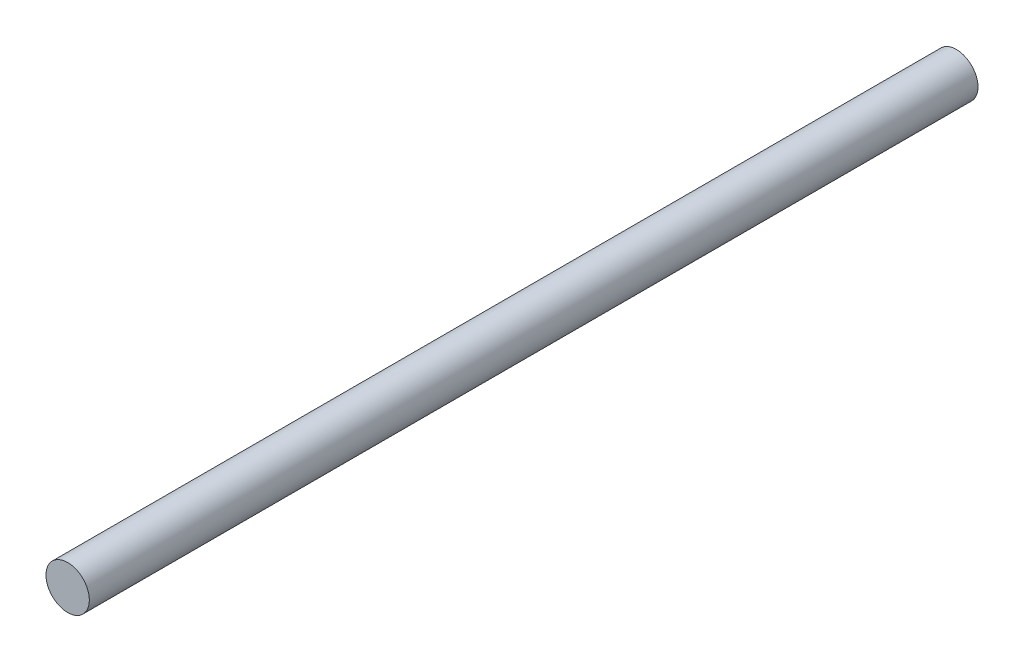
ISO-10303-21;
HEADER;
FILE_DESCRIPTION(('STEP AP214'),'2;1');
FILE_NAME('part.step','',(''),(''),'','','');
FILE_SCHEMA(('AUTOMOTIVE_DESIGN { 1 0 10303 214 1 1 1 1 }'));
ENDSEC;
DATA;
#1=APPLICATION_CONTEXT('core data for automotive mechanical design processes');
#2=APPLICATION_PROTOCOL_DEFINITION('international standard','automotive_design',2000,#1);
#3=PRODUCT_CONTEXT('',#1,'mechanical');
#4=PRODUCT('Part','Part','',(#3));
#5=PRODUCT_RELATED_PRODUCT_CATEGORY('part','',(#4));
#6=PRODUCT_DEFINITION_FORMATION('','',#4);
#7=PRODUCT_DEFINITION_CONTEXT('part definition',#1,'design');
#8=PRODUCT_DEFINITION('design','',#6,#7);
#9=PRODUCT_DEFINITION_SHAPE('','',#8);
#10=(LENGTH_UNIT() NAMED_UNIT(*) SI_UNIT(.MILLI.,.METRE.));
#11=(NAMED_UNIT(*) PLANE_ANGLE_UNIT() SI_UNIT($,.RADIAN.));
#12=(NAMED_UNIT(*) SI_UNIT($,.STERADIAN.) SOLID_ANGLE_UNIT());
#13=UNCERTAINTY_MEASURE_WITH_UNIT(LENGTH_MEASURE(1.E-05),#10,'distance_accuracy_value','');
#14=(GEOMETRIC_REPRESENTATION_CONTEXT(3) GLOBAL_UNCERTAINTY_ASSIGNED_CONTEXT((#13)) GLOBAL_UNIT_ASSIGNED_CONTEXT((#10,
#11,#12)) REPRESENTATION_CONTEXT('',''));
#15=CARTESIAN_POINT('',(0.,0.,0.));
#16=DIRECTION('',(0.,0.,1.));
#17=DIRECTION('',(1.,0.,0.));
#18=AXIS2_PLACEMENT_3D('',#15,#16,#17);
#19=CARTESIAN_POINT('',(0.,0.,100.));
#20=DIRECTION('',(0.,0.,-1.));
#21=DIRECTION('',(-1.,0.,0.));
#22=AXIS2_PLACEMENT_3D('',#19,#20,#21);
#23=CYLINDRICAL_SURFACE('',#22,2.44);
#24=CARTESIAN_POINT('',(0.,0.,100.));
#25=DIRECTION('',(0.,0.,1.));
#26=DIRECTION('',(1.,0.,0.));
#27=AXIS2_PLACEMENT_3D('',#24,#25,#26);
#28=CIRCLE('',#27,2.44);
#29=CARTESIAN_POINT('',(2.44,0.,100.));
#30=VERTEX_POINT('',#29);
#31=EDGE_CURVE('E10',#30,#30,#28,.T.);
#32=ORIENTED_EDGE('',*,*,#31,.F.);
#33=EDGE_LOOP('',(#32));
#34=FACE_BOUND('',#33,.T.);
#35=CARTESIAN_POINT('',(0.,0.,0.));
#36=DIRECTION('',(0.,0.,1.));
#37=DIRECTION('',(1.,0.,0.));
#38=AXIS2_PLACEMENT_3D('',#35,#36,#37);
#39=CIRCLE('',#38,2.44);
#40=CARTESIAN_POINT('',(2.44,0.,0.));
#41=VERTEX_POINT('',#40);
#42=EDGE_CURVE('E38',#41,#41,#39,.T.);
#43=ORIENTED_EDGE('',*,*,#42,.T.);
#44=EDGE_LOOP('',(#43));
#45=FACE_BOUND('',#44,.T.);
#46=ADVANCED_FACE('F35',(#34,#45),#23,.T.);
#47=CARTESIAN_POINT('',(0.,0.,100.));
#48=DIRECTION('',(0.,0.,1.));
#49=DIRECTION('',(1.,0.,0.));
#50=AXIS2_PLACEMENT_3D('',#47,#48,#49);
#51=PLANE('',#50);
#52=ORIENTED_EDGE('',*,*,#31,.T.);
#53=EDGE_LOOP('',(#52));
#54=FACE_BOUND('',#53,.T.);
#55=ADVANCED_FACE('F50',(#54),#51,.T.);
#56=CARTESIAN_POINT('',(0.,0.,0.));
#57=DIRECTION('',(0.,0.,1.));
#58=DIRECTION('',(1.,0.,0.));
#59=AXIS2_PLACEMENT_3D('',#56,#57,#58);
#60=PLANE('',#59);
#61=ORIENTED_EDGE('',*,*,#42,.F.);
#62=EDGE_LOOP('',(#61));
#63=FACE_BOUND('',#62,.T.);
#64=ADVANCED_FACE('F48',(#63),#60,.F.);
#65=CLOSED_SHELL('',(#46,#55,#64));
#66=MANIFOLD_SOLID_BREP('B2',#65);
#67=ADVANCED_BREP_SHAPE_REPRESENTATION('',(#18,#66),#14);
#68=SHAPE_DEFINITION_REPRESENTATION(#9,#67);
ENDSEC;
END-ISO-10303-21;
